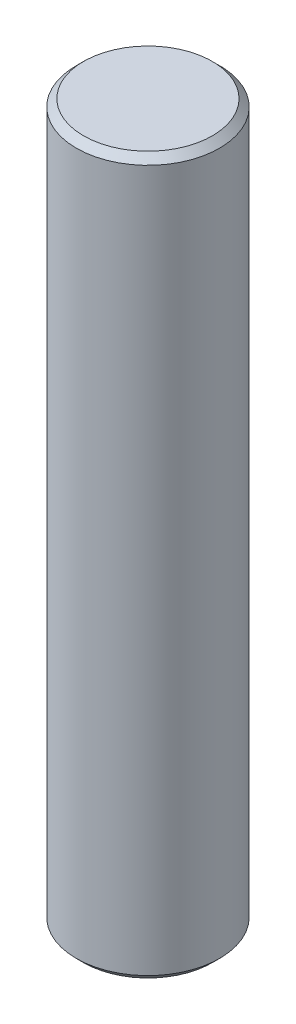
ISO-10303-21;
HEADER;
FILE_DESCRIPTION(('STEP AP214'),'2;1');
FILE_NAME('part.step','',(''),(''),'','','');
FILE_SCHEMA(('AUTOMOTIVE_DESIGN { 1 0 10303 214 1 1 1 1 }'));
ENDSEC;
DATA;
#1=APPLICATION_CONTEXT('core data for automotive mechanical design processes');
#2=APPLICATION_PROTOCOL_DEFINITION('international standard','automotive_design',2000,#1);
#3=PRODUCT_CONTEXT('',#1,'mechanical');
#4=PRODUCT('Part','Part','',(#3));
#5=PRODUCT_RELATED_PRODUCT_CATEGORY('part','',(#4));
#6=PRODUCT_DEFINITION_FORMATION('','',#4);
#7=PRODUCT_DEFINITION_CONTEXT('part definition',#1,'design');
#8=PRODUCT_DEFINITION('design','',#6,#7);
#9=PRODUCT_DEFINITION_SHAPE('','',#8);
#10=(LENGTH_UNIT() NAMED_UNIT(*) SI_UNIT(.MILLI.,.METRE.));
#11=(NAMED_UNIT(*) PLANE_ANGLE_UNIT() SI_UNIT($,.RADIAN.));
#12=(NAMED_UNIT(*) SI_UNIT($,.STERADIAN.) SOLID_ANGLE_UNIT());
#13=UNCERTAINTY_MEASURE_WITH_UNIT(LENGTH_MEASURE(1.E-05),#10,'distance_accuracy_value','');
#14=(GEOMETRIC_REPRESENTATION_CONTEXT(3) GLOBAL_UNCERTAINTY_ASSIGNED_CONTEXT((#13)) GLOBAL_UNIT_ASSIGNED_CONTEXT((#10,
#11,#12)) REPRESENTATION_CONTEXT('',''));
#15=CARTESIAN_POINT('',(0.,0.,0.));
#16=DIRECTION('',(0.,0.,1.));
#17=DIRECTION('',(1.,0.,0.));
#18=AXIS2_PLACEMENT_3D('',#15,#16,#17);
#19=CARTESIAN_POINT('',(0.,25.,0.));
#20=DIRECTION('',(0.,-1.,0.));
#21=DIRECTION('',(0.,0.,-1.));
#22=AXIS2_PLACEMENT_3D('',#19,#20,#21);
#23=CYLINDRICAL_SURFACE('',#22,2.499995);
#24=CARTESIAN_POINT('',(0.,0.25,0.));
#25=DIRECTION('',(0.,1.,0.));
#26=DIRECTION('',(0.,0.,1.));
#27=AXIS2_PLACEMENT_3D('',#24,#25,#26);
#28=CIRCLE('',#27,2.499995);
#29=CARTESIAN_POINT('',(0.,0.25,2.499995));
#30=VERTEX_POINT('',#29);
#31=EDGE_CURVE('E44',#30,#30,#28,.T.);
#32=ORIENTED_EDGE('',*,*,#31,.T.);
#33=EDGE_LOOP('',(#32));
#34=FACE_BOUND('',#33,.T.);
#35=CARTESIAN_POINT('',(0.,24.75,0.));
#36=DIRECTION('',(0.,1.,0.));
#37=DIRECTION('',(0.,0.,1.));
#38=AXIS2_PLACEMENT_3D('',#35,#36,#37);
#39=CIRCLE('',#38,2.499995);
#40=CARTESIAN_POINT('',(0.,24.75,2.499995));
#41=VERTEX_POINT('',#40);
#42=EDGE_CURVE('E48',#41,#41,#39,.F.);
#43=ORIENTED_EDGE('',*,*,#42,.T.);
#44=EDGE_LOOP('',(#43));
#45=FACE_BOUND('',#44,.T.);
#46=ADVANCED_FACE('F32',(#34,#45),#23,.T.);
#47=CARTESIAN_POINT('',(0.,25.,0.));
#48=DIRECTION('',(0.,1.,0.));
#49=DIRECTION('',(0.,0.,1.));
#50=AXIS2_PLACEMENT_3D('',#47,#48,#49);
#51=PLANE('',#50);
#52=CARTESIAN_POINT('',(0.,25.,0.));
#53=DIRECTION('',(0.,1.,0.));
#54=DIRECTION('',(0.,0.,1.));
#55=AXIS2_PLACEMENT_3D('',#52,#53,#54);
#56=CIRCLE('',#55,2.249995);
#57=CARTESIAN_POINT('',(0.,25.,2.249995));
#58=VERTEX_POINT('',#57);
#59=EDGE_CURVE('E10',#58,#58,#56,.T.);
#60=ORIENTED_EDGE('',*,*,#59,.T.);
#61=EDGE_LOOP('',(#60));
#62=FACE_BOUND('',#61,.T.);
#63=ADVANCED_FACE('F64',(#62),#51,.T.);
#64=CARTESIAN_POINT('',(0.,0.,0.));
#65=DIRECTION('',(0.,1.,0.));
#66=DIRECTION('',(0.,0.,1.));
#67=AXIS2_PLACEMENT_3D('',#64,#65,#66);
#68=PLANE('',#67);
#69=CARTESIAN_POINT('',(0.,0.,0.));
#70=DIRECTION('',(0.,1.,0.));
#71=DIRECTION('',(0.,0.,1.));
#72=AXIS2_PLACEMENT_3D('',#69,#70,#71);
#73=CIRCLE('',#72,2.249995);
#74=CARTESIAN_POINT('',(0.,0.,2.249995));
#75=VERTEX_POINT('',#74);
#76=EDGE_CURVE('E40',#75,#75,#73,.F.);
#77=ORIENTED_EDGE('',*,*,#76,.T.);
#78=EDGE_LOOP('',(#77));
#79=FACE_BOUND('',#78,.T.);
#80=ADVANCED_FACE('F61',(#79),#68,.F.);
#81=CARTESIAN_POINT('',(0.,0.25,0.));
#82=DIRECTION('',(0.,1.,0.));
#83=DIRECTION('',(0.,0.,1.));
#84=AXIS2_PLACEMENT_3D('',#81,#82,#83);
#85=CONICAL_SURFACE('',#84,2.499995,0.785398163397448);
#86=ORIENTED_EDGE('',*,*,#76,.F.);
#87=EDGE_LOOP('',(#86));
#88=FACE_BOUND('',#87,.T.);
#89=ORIENTED_EDGE('',*,*,#31,.F.);
#90=EDGE_LOOP('',(#89));
#91=FACE_BOUND('',#90,.T.);
#92=ADVANCED_FACE('F57',(#88,#91),#85,.T.);
#93=CARTESIAN_POINT('',(0.,25.,0.));
#94=DIRECTION('',(0.,-1.,0.));
#95=DIRECTION('',(0.,0.,-1.));
#96=AXIS2_PLACEMENT_3D('',#93,#94,#95);
#97=CONICAL_SURFACE('',#96,2.249995,0.785398163397448);
#98=ORIENTED_EDGE('',*,*,#42,.F.);
#99=EDGE_LOOP('',(#98));
#100=FACE_BOUND('',#99,.T.);
#101=ORIENTED_EDGE('',*,*,#59,.F.);
#102=EDGE_LOOP('',(#101));
#103=FACE_BOUND('',#102,.T.);
#104=ADVANCED_FACE('F35',(#100,#103),#97,.T.);
#105=CLOSED_SHELL('',(#46,#63,#80,#92,#104));
#106=MANIFOLD_SOLID_BREP('B2',#105);
#107=ADVANCED_BREP_SHAPE_REPRESENTATION('',(#18,#106),#14);
#108=SHAPE_DEFINITION_REPRESENTATION(#9,#107);
ENDSEC;
END-ISO-10303-21;
